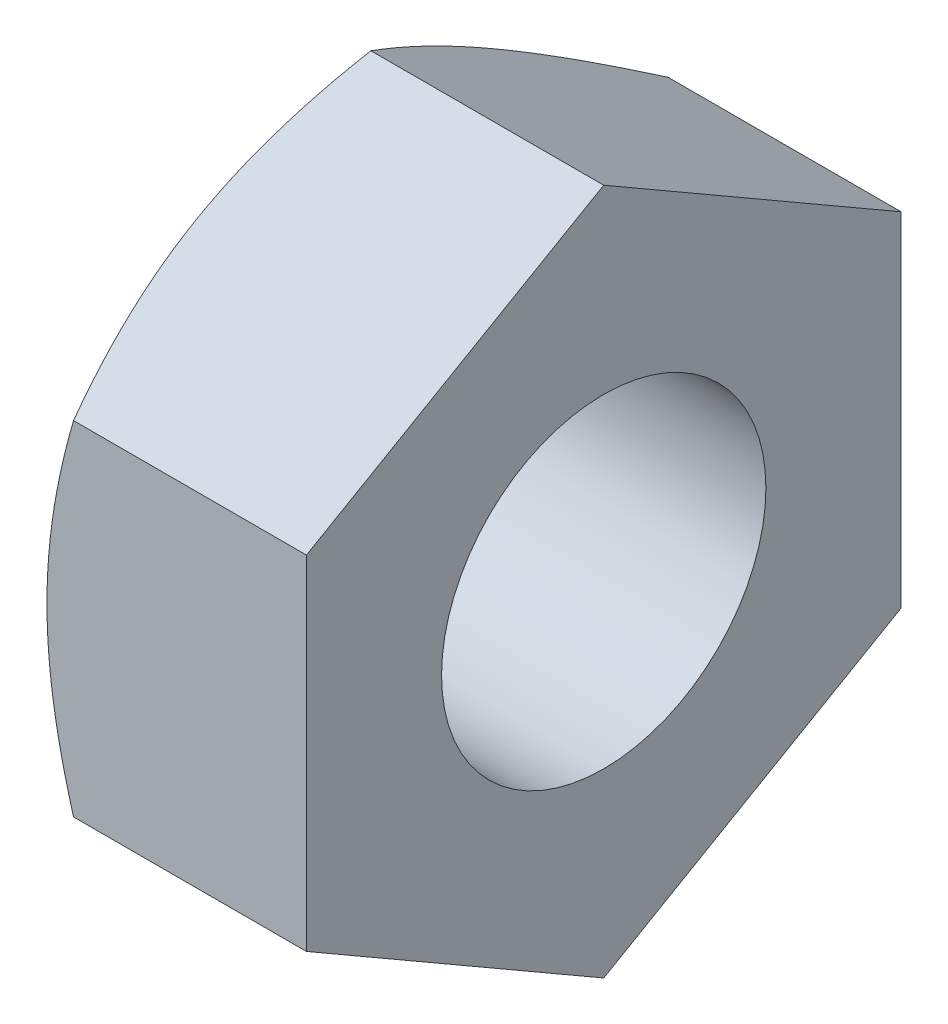
ISO-10303-21;
HEADER;
FILE_DESCRIPTION(('STEP AP214'),'2;1');
FILE_NAME('part.step','',(''),(''),'','','');
FILE_SCHEMA(('AUTOMOTIVE_DESIGN { 1 0 10303 214 1 1 1 1 }'));
ENDSEC;
DATA;
#1=APPLICATION_CONTEXT('core data for automotive mechanical design processes');
#2=APPLICATION_PROTOCOL_DEFINITION('international standard','automotive_design',2000,#1);
#3=PRODUCT_CONTEXT('',#1,'mechanical');
#4=PRODUCT('Part','Part','',(#3));
#5=PRODUCT_RELATED_PRODUCT_CATEGORY('part','',(#4));
#6=PRODUCT_DEFINITION_FORMATION('','',#4);
#7=PRODUCT_DEFINITION_CONTEXT('part definition',#1,'design');
#8=PRODUCT_DEFINITION('design','',#6,#7);
#9=PRODUCT_DEFINITION_SHAPE('','',#8);
#10=(LENGTH_UNIT() NAMED_UNIT(*) SI_UNIT(.MILLI.,.METRE.));
#11=(NAMED_UNIT(*) PLANE_ANGLE_UNIT() SI_UNIT($,.RADIAN.));
#12=(NAMED_UNIT(*) SI_UNIT($,.STERADIAN.) SOLID_ANGLE_UNIT());
#13=UNCERTAINTY_MEASURE_WITH_UNIT(LENGTH_MEASURE(1.E-05),#10,'distance_accuracy_value','');
#14=(GEOMETRIC_REPRESENTATION_CONTEXT(3) GLOBAL_UNCERTAINTY_ASSIGNED_CONTEXT((#13)) GLOBAL_UNIT_ASSIGNED_CONTEXT((#10,
#11,#12)) REPRESENTATION_CONTEXT('',''));
#15=CARTESIAN_POINT('',(0.,0.,0.));
#16=DIRECTION('',(0.,0.,1.));
#17=DIRECTION('',(1.,0.,0.));
#18=AXIS2_PLACEMENT_3D('',#15,#16,#17);
#19=CARTESIAN_POINT('',(-2.4,1.58771324027147,-2.75));
#20=DIRECTION('',(0.,0.866025403784439,-0.5));
#21=DIRECTION('',(0.,0.5,0.866025403784439));
#22=AXIS2_PLACEMENT_3D('',#19,#20,#21);
#23=PLANE('',#22);
#24=DIRECTION('',(1.,0.,0.));
#25=VECTOR('',#24,1.);
#26=CARTESIAN_POINT('',(-2.4,1.58771324027147,-2.75));
#27=LINE('',#26,#25);
#28=CARTESIAN_POINT('',(-2.15437990693814,1.58771324027146,-2.75));
#29=VERTEX_POINT('',#28);
#30=CARTESIAN_POINT('',(0.,1.58771324027147,-2.75));
#31=VERTEX_POINT('',#30);
#32=EDGE_CURVE('E139',#29,#31,#27,.T.);
#33=ORIENTED_EDGE('',*,*,#32,.F.);
#34=CARTESIAN_POINT('',(-2.15431323663524,1.58759777021763,-2.7502));
#35=CARTESIAN_POINT('',(-2.19461233775074,1.65737010029698,-2.62935077934009));
#36=CARTESIAN_POINT('',(-2.23126309740234,1.72774469983533,-2.50745839737737));
#37=CARTESIAN_POINT('',(-2.2952378170302,1.86971254687002,-2.26156287327211));
#38=CARTESIAN_POINT('',(-2.32253914432551,1.94130831721582,-2.13755536142615));
#39=CARTESIAN_POINT('',(-2.36503825470589,2.08361254889598,-1.89107720202406));
#40=CARTESIAN_POINT('',(-2.38051888137754,2.15429911309863,-1.76864448141258));
#41=CARTESIAN_POINT('',(-2.39900060263006,2.29600490065922,-1.52320285763109));
#42=CARTESIAN_POINT('',(-2.4020170005374,2.36702360884403,-1.40019484676709));
#43=CARTESIAN_POINT('',(-2.39574685457146,2.49972966594896,-1.17034121338921));
#44=CARTESIAN_POINT('',(-2.3879998457233,2.56143686540072,-1.06346120874598));
#45=CARTESIAN_POINT('',(-2.36344481893565,2.68444923614046,-0.850397532665252));
#46=CARTESIAN_POINT('',(-2.34662841034943,2.74575398185007,-0.744214598351112));
#47=CARTESIAN_POINT('',(-2.30458807765405,2.86902004703206,-0.530711510606818));
#48=CARTESIAN_POINT('',(-2.27918591931277,2.93096576264318,-0.423418383857146));
#49=CARTESIAN_POINT('',(-2.22153277416002,3.05393320806133,-0.21043252071595));
#50=CARTESIAN_POINT('',(-2.18929533670102,3.11495651365995,-0.104737054973348));
#51=CARTESIAN_POINT('',(-2.15431323663525,3.17554195059677,0.000199999999999626));
#52=B_SPLINE_CURVE_WITH_KNOTS('',3,(#34,#35,#36,#37,#38,#39,#40,#41,#42,#43,#44,#45,#46,#47,#48,
#49,#50,#51),.UNSPECIFIED.,.F.,.F.,(4,2,2,2,2,2,2,2,4),(0.,0.435912828725887,0.87287355711633,
1.29901931904671,1.72464171213573,2.09526089052937,2.46622354066374,2.84541551798557,
3.22386274754524),.UNSPECIFIED.);
#53=CARTESIAN_POINT('',(-2.4,2.38156986040721,-1.375));
#54=VERTEX_POINT('',#53);
#55=EDGE_CURVE('E120',#29,#54,#52,.T.);
#56=ORIENTED_EDGE('',*,*,#55,.T.);
#57=CARTESIAN_POINT('',(-2.15437990693814,3.17542648054294,0.));
#58=VERTEX_POINT('',#57);
#59=EDGE_CURVE('E52',#54,#58,#52,.T.);
#60=ORIENTED_EDGE('',*,*,#59,.T.);
#61=DIRECTION('',(1.,0.,0.));
#62=VECTOR('',#61,1.);
#63=CARTESIAN_POINT('',(-2.4,3.17542648054294,0.));
#64=LINE('',#63,#62);
#65=CARTESIAN_POINT('',(0.,3.17542648054294,0.));
#66=VERTEX_POINT('',#65);
#67=EDGE_CURVE('E118',#58,#66,#64,.T.);
#68=ORIENTED_EDGE('',*,*,#67,.T.);
#69=DIRECTION('',(0.,0.5,0.866025403784439));
#70=VECTOR('',#69,1.);
#71=CARTESIAN_POINT('',(0.,1.58771324027147,-2.75));
#72=LINE('',#71,#70);
#73=EDGE_CURVE('E150',#31,#66,#72,.T.);
#74=ORIENTED_EDGE('',*,*,#73,.F.);
#75=EDGE_LOOP('',(#33,#56,#60,#68,#74));
#76=FACE_BOUND('',#75,.T.);
#77=ADVANCED_FACE('F36',(#76),#23,.T.);
#78=CARTESIAN_POINT('',(-2.4,-1.58771324027148,-2.75));
#79=DIRECTION('',(0.,0.,-1.));
#80=DIRECTION('',(-1.,0.,0.));
#81=AXIS2_PLACEMENT_3D('',#78,#79,#80);
#82=PLANE('',#81);
#83=DIRECTION('',(1.,0.,0.));
#84=VECTOR('',#83,1.);
#85=CARTESIAN_POINT('',(-2.4,-1.58771324027148,-2.75));
#86=LINE('',#85,#84);
#87=CARTESIAN_POINT('',(-2.15437990693814,-1.58771324027149,-2.74999999999998));
#88=VERTEX_POINT('',#87);
#89=CARTESIAN_POINT('',(0.,-1.58771324027148,-2.75));
#90=VERTEX_POINT('',#89);
#91=EDGE_CURVE('E137',#88,#90,#86,.T.);
#92=ORIENTED_EDGE('',*,*,#91,.F.);
#93=CARTESIAN_POINT('',(-1.08405156039708,-4.21084949309676,-2.75));
#94=CARTESIAN_POINT('',(-1.14240006384777,-4.0901089421409,-2.75));
#95=CARTESIAN_POINT('',(-1.20016853488243,-3.9690829206551,-2.75));
#96=CARTESIAN_POINT('',(-1.31421396157696,-3.72630558284844,-2.75));
#97=CARTESIAN_POINT('',(-1.37049065899754,-3.60455414536201,-2.75));
#98=CARTESIAN_POINT('',(-1.48151755664725,-3.35951393034355,-2.75));
#99=CARTESIAN_POINT('',(-1.53625717839417,-3.23622034236437,-2.75));
#100=CARTESIAN_POINT('',(-1.64338522252356,-2.98861980138744,-2.75));
#101=CARTESIAN_POINT('',(-1.69577376746325,-2.86431290161182,-2.75));
#102=CARTESIAN_POINT('',(-1.79819642785388,-2.61294485887172,-2.75));
#103=CARTESIAN_POINT('',(-1.84819374210161,-2.48586863815655,-2.75));
#104=CARTESIAN_POINT('',(-1.9442725912154,-2.23021732171541,-2.75));
#105=CARTESIAN_POINT('',(-1.99035369042303,-2.10164206103364,-2.75));
#106=CARTESIAN_POINT('',(-2.07736192295377,-1.84305218799468,-2.75));
#107=CARTESIAN_POINT('',(-2.11830001358611,-1.71304130052584,-2.75));
#108=CARTESIAN_POINT('',(-2.19369269237565,-1.45117125062148,-2.75));
#109=CARTESIAN_POINT('',(-2.22814933084723,-1.31931268690203,-2.75));
#110=CARTESIAN_POINT('',(-2.2889063284691,-1.05365722480013,-2.75));
#111=CARTESIAN_POINT('',(-2.31520451590488,-0.919859820217597,-2.75));
#112=CARTESIAN_POINT('',(-2.35787396280339,-0.650651874037387,-2.75));
#113=CARTESIAN_POINT('',(-2.37424521348946,-0.515241331013601,-2.75));
#114=CARTESIAN_POINT('',(-2.39561250345976,-0.244373242869217,-2.75));
#115=CARTESIAN_POINT('',(-2.40068055677322,-0.108921526377139,-2.75));
#116=CARTESIAN_POINT('',(-2.39917220436733,0.161887058855127,-2.75));
#117=CARTESIAN_POINT('',(-2.39259882131445,0.297243943089634,-2.75));
#118=CARTESIAN_POINT('',(-2.37189586995316,0.528385436717537,-2.75));
#119=CARTESIAN_POINT('',(-2.36046235896981,0.624425050137497,-2.75));
#120=CARTESIAN_POINT('',(-2.33247828038665,0.815762399811543,-2.75));
#121=CARTESIAN_POINT('',(-2.31592690577232,0.911060016631967,-2.75));
#122=CARTESIAN_POINT('',(-2.25946463872172,1.19576218748917,-2.75));
#123=CARTESIAN_POINT('',(-2.21276014058271,1.38383224738498,-2.75));
#124=CARTESIAN_POINT('',(-2.13220750296942,1.66525048947487,-2.75));
#125=CARTESIAN_POINT('',(-2.1031966650045,1.76006556248559,-2.75));
#126=CARTESIAN_POINT('',(-2.04230435109341,1.94870609382217,-2.75));
#127=CARTESIAN_POINT('',(-2.0104248551215,2.04253218553698,-2.75));
#128=CARTESIAN_POINT('',(-1.94445858181355,2.22880240354987,-2.75));
#129=CARTESIAN_POINT('',(-1.91038523854447,2.32125133588454,-2.75));
#130=CARTESIAN_POINT('',(-1.84023863176889,2.50543192042631,-2.75));
#131=CARTESIAN_POINT('',(-1.80416455996268,2.59716326539582,-2.75));
#132=CARTESIAN_POINT('',(-1.76728755800251,2.68856293053349,-2.75));
#133=B_SPLINE_CURVE_WITH_KNOTS('',3,(#93,#94,#95,#96,#97,#98,#99,#100,#101,#102,#103,#104,#105,
#106,#107,#108,#109,#110,#111,#112,#113,#114,#115,#116,#117,#118,#119,#120,#121,#122,#123,#124,
#125,#126,#127,#128,#129,#130,#131,#132),.UNSPECIFIED.,.F.,.F.,(4,2,2,2,2,2,2,2,2,2,2,2,2,2,2,2,
2,2,2,4),(0.,0.402305607365936,0.804680408536997,1.20935783819118,1.61401414820818,
2.0236383818577,2.43330812457348,2.842089694796,3.25074173456636,3.65950246109143,
4.06826354901183,4.47441284024649,4.88045669141171,5.17046846817546,5.46052599902452,
6.04107275309884,6.33851131304663,6.63574613017457,6.93130791005795,7.22698998004825),.UNSPECIFIED.);
#134=CARTESIAN_POINT('',(-2.4,0.,-2.75));
#135=VERTEX_POINT('',#134);
#136=EDGE_CURVE('E241',#88,#135,#133,.T.);
#137=ORIENTED_EDGE('',*,*,#136,.T.);
#138=EDGE_CURVE('E163',#135,#29,#133,.T.);
#139=ORIENTED_EDGE('',*,*,#138,.T.);
#140=ORIENTED_EDGE('',*,*,#32,.T.);
#141=DIRECTION('',(0.,1.,0.));
#142=VECTOR('',#141,1.);
#143=CARTESIAN_POINT('',(0.,-1.58771324027148,-2.75));
#144=LINE('',#143,#142);
#145=EDGE_CURVE('E127',#90,#31,#144,.T.);
#146=ORIENTED_EDGE('',*,*,#145,.F.);
#147=EDGE_LOOP('',(#92,#137,#139,#140,#146));
#148=FACE_BOUND('',#147,.T.);
#149=ADVANCED_FACE('F227',(#148),#82,.T.);
#150=CARTESIAN_POINT('',(-2.4,-3.17542648054295,0.));
#151=DIRECTION('',(0.,-0.866025403784439,-0.5));
#152=DIRECTION('',(0.,0.5,-0.866025403784439));
#153=AXIS2_PLACEMENT_3D('',#150,#151,#152);
#154=PLANE('',#153);
#155=DIRECTION('',(1.,0.,0.));
#156=VECTOR('',#155,1.);
#157=CARTESIAN_POINT('',(-2.4,-3.17542648054295,0.));
#158=LINE('',#157,#156);
#159=CARTESIAN_POINT('',(-2.15437990693814,-3.17542648054294,0.));
#160=VERTEX_POINT('',#159);
#161=CARTESIAN_POINT('',(0.,-3.17542648054295,0.));
#162=VERTEX_POINT('',#161);
#163=EDGE_CURVE('E135',#160,#162,#158,.T.);
#164=ORIENTED_EDGE('',*,*,#163,.F.);
#165=CARTESIAN_POINT('',(-2.15431323663524,-3.17554195059679,0.000199999999999914));
#166=CARTESIAN_POINT('',(-2.19461233775074,-3.10576962051743,-0.120649220659906));
#167=CARTESIAN_POINT('',(-2.23126309740234,-3.03539502097909,-0.242541602622635));
#168=CARTESIAN_POINT('',(-2.2952378170302,-2.89342717394439,-0.488437126727894));
#169=CARTESIAN_POINT('',(-2.3225391443255,-2.82183140359859,-0.612444638573857));
#170=CARTESIAN_POINT('',(-2.36503825470588,-2.67952717191843,-0.858922797975945));
#171=CARTESIAN_POINT('',(-2.38051888137754,-2.60884060771578,-0.981355518587419));
#172=CARTESIAN_POINT('',(-2.39900060263006,-2.46713482015519,-1.22679714236892));
#173=CARTESIAN_POINT('',(-2.4020170005374,-2.39611611197038,-1.34980515323291));
#174=CARTESIAN_POINT('',(-2.39574685457145,-2.26341005486545,-1.5796587866108));
#175=CARTESIAN_POINT('',(-2.38799984572329,-2.20170285541369,-1.68653879125402));
#176=CARTESIAN_POINT('',(-2.36344481893564,-2.07869048467395,-1.89960246733475));
#177=CARTESIAN_POINT('',(-2.34662841034943,-2.01738573896434,-2.00578540164889));
#178=CARTESIAN_POINT('',(-2.30458807765404,-1.89411967378236,-2.21928848939318));
#179=CARTESIAN_POINT('',(-2.27918591931277,-1.83217395817124,-2.32658161614286));
#180=CARTESIAN_POINT('',(-2.22153277416002,-1.70920651275308,-2.53956747928405));
#181=CARTESIAN_POINT('',(-2.18929533670102,-1.64818320715447,-2.64526294502665));
#182=CARTESIAN_POINT('',(-2.15431323663524,-1.58759777021764,-2.7502));
#183=B_SPLINE_CURVE_WITH_KNOTS('',3,(#165,#166,#167,#168,#169,#170,#171,#172,#173,#174,#175,
#176,#177,#178,#179,#180,#181,#182),.UNSPECIFIED.,.F.,.F.,(4,2,2,2,2,2,2,2,4),(0.,
0.435912828725889,0.872873557116333,1.29901931904672,1.72464171213574,2.09526089052938,
2.46622354066374,2.84541551798557,3.22386274754524),.UNSPECIFIED.);
#184=CARTESIAN_POINT('',(-2.4,-2.38156986040721,-1.375));
#185=VERTEX_POINT('',#184);
#186=EDGE_CURVE('E152',#160,#185,#183,.T.);
#187=ORIENTED_EDGE('',*,*,#186,.T.);
#188=EDGE_CURVE('E153',#185,#88,#183,.T.);
#189=ORIENTED_EDGE('',*,*,#188,.T.);
#190=ORIENTED_EDGE('',*,*,#91,.T.);
#191=DIRECTION('',(0.,0.5,-0.866025403784439));
#192=VECTOR('',#191,1.);
#193=CARTESIAN_POINT('',(0.,-3.17542648054295,0.));
#194=LINE('',#193,#192);
#195=EDGE_CURVE('E131',#162,#90,#194,.T.);
#196=ORIENTED_EDGE('',*,*,#195,.F.);
#197=EDGE_LOOP('',(#164,#187,#189,#190,#196));
#198=FACE_BOUND('',#197,.T.);
#199=ADVANCED_FACE('F170',(#198),#154,.T.);
#200=CARTESIAN_POINT('',(-2.4,-1.58771324027148,2.75));
#201=DIRECTION('',(0.,-0.866025403784439,0.5));
#202=DIRECTION('',(0.,-0.5,-0.866025403784439));
#203=AXIS2_PLACEMENT_3D('',#200,#201,#202);
#204=PLANE('',#203);
#205=DIRECTION('',(1.,0.,0.));
#206=VECTOR('',#205,1.);
#207=CARTESIAN_POINT('',(-2.4,-1.58771324027148,2.75));
#208=LINE('',#207,#206);
#209=CARTESIAN_POINT('',(-2.15437990693814,-1.58771324027146,2.75));
#210=VERTEX_POINT('',#209);
#211=CARTESIAN_POINT('',(0.,-1.58771324027148,2.75));
#212=VERTEX_POINT('',#211);
#213=EDGE_CURVE('E128',#210,#212,#208,.T.);
#214=ORIENTED_EDGE('',*,*,#213,.F.);
#215=CARTESIAN_POINT('',(-2.15431323663524,-1.58759777021764,2.7502));
#216=CARTESIAN_POINT('',(-2.19461233775074,-1.65737010029699,2.62935077934009));
#217=CARTESIAN_POINT('',(-2.23126309740234,-1.72774469983534,2.50745839737737));
#218=CARTESIAN_POINT('',(-2.2952378170302,-1.86971254687003,2.26156287327211));
#219=CARTESIAN_POINT('',(-2.3225391443255,-1.94130831721584,2.13755536142614));
#220=CARTESIAN_POINT('',(-2.36503825470588,-2.083612548896,1.89107720202406));
#221=CARTESIAN_POINT('',(-2.38051888137754,-2.15429911309865,1.76864448141258));
#222=CARTESIAN_POINT('',(-2.39900060263006,-2.29600490065924,1.52320285763108));
#223=CARTESIAN_POINT('',(-2.4020170005374,-2.36702360884404,1.40019484676709));
#224=CARTESIAN_POINT('',(-2.39574685457145,-2.49972966594898,1.17034121338921));
#225=CARTESIAN_POINT('',(-2.38799984572329,-2.56143686540073,1.06346120874598));
#226=CARTESIAN_POINT('',(-2.36344481893564,-2.68444923614047,0.85039753266525));
#227=CARTESIAN_POINT('',(-2.34662841034943,-2.74575398185009,0.744214598351111));
#228=CARTESIAN_POINT('',(-2.30458807765404,-2.86902004703207,0.530711510606816));
#229=CARTESIAN_POINT('',(-2.27918591931277,-2.93096576264319,0.423418383857145));
#230=CARTESIAN_POINT('',(-2.22153277416002,-3.05393320806134,0.210432520715949));
#231=CARTESIAN_POINT('',(-2.18929533670102,-3.11495651365996,0.104737054973347));
#232=CARTESIAN_POINT('',(-2.15431323663524,-3.17554195059679,-0.000199999999999977));
#233=B_SPLINE_CURVE_WITH_KNOTS('',3,(#215,#216,#217,#218,#219,#220,#221,#222,#223,#224,#225,
#226,#227,#228,#229,#230,#231,#232),.UNSPECIFIED.,.F.,.F.,(4,2,2,2,2,2,2,2,4),(0.,
0.435912828725889,0.872873557116332,1.29901931904672,1.72464171213574,2.09526089052937,
2.46622354066374,2.84541551798557,3.22386274754524),.UNSPECIFIED.);
#234=CARTESIAN_POINT('',(-2.4,-2.38156986040721,1.375));
#235=VERTEX_POINT('',#234);
#236=EDGE_CURVE('E203',#210,#235,#233,.T.);
#237=ORIENTED_EDGE('',*,*,#236,.T.);
#238=EDGE_CURVE('E162',#235,#160,#233,.T.);
#239=ORIENTED_EDGE('',*,*,#238,.T.);
#240=ORIENTED_EDGE('',*,*,#163,.T.);
#241=DIRECTION('',(0.,-0.5,-0.866025403784438));
#242=VECTOR('',#241,1.);
#243=CARTESIAN_POINT('',(0.,-1.58771324027148,2.75));
#244=LINE('',#243,#242);
#245=EDGE_CURVE('E143',#212,#162,#244,.T.);
#246=ORIENTED_EDGE('',*,*,#245,.F.);
#247=EDGE_LOOP('',(#214,#237,#239,#240,#246));
#248=FACE_BOUND('',#247,.T.);
#249=ADVANCED_FACE('F210',(#248),#204,.T.);
#250=CARTESIAN_POINT('',(-2.4,1.58771324027147,2.75));
#251=DIRECTION('',(0.,0.,1.));
#252=DIRECTION('',(1.,0.,0.));
#253=AXIS2_PLACEMENT_3D('',#250,#251,#252);
#254=PLANE('',#253);
#255=DIRECTION('',(1.,0.,0.));
#256=VECTOR('',#255,1.);
#257=CARTESIAN_POINT('',(-2.4,1.58771324027147,2.75));
#258=LINE('',#257,#256);
#259=CARTESIAN_POINT('',(-2.15437990693814,1.58771324027147,2.75));
#260=VERTEX_POINT('',#259);
#261=CARTESIAN_POINT('',(0.,1.58771324027147,2.75));
#262=VERTEX_POINT('',#261);
#263=EDGE_CURVE('E126',#260,#262,#258,.T.);
#264=ORIENTED_EDGE('',*,*,#263,.F.);
#265=CARTESIAN_POINT('',(-1.08405156039708,-4.21084949309676,2.75));
#266=CARTESIAN_POINT('',(-1.14240006384777,-4.0901089421409,2.75));
#267=CARTESIAN_POINT('',(-1.20016853488243,-3.9690829206551,2.75));
#268=CARTESIAN_POINT('',(-1.31421396157696,-3.72630558284844,2.75));
#269=CARTESIAN_POINT('',(-1.37049065899754,-3.60455414536201,2.75));
#270=CARTESIAN_POINT('',(-1.48151755664725,-3.35951393034355,2.75));
#271=CARTESIAN_POINT('',(-1.53625717839417,-3.23622034236437,2.75));
#272=CARTESIAN_POINT('',(-1.64338522252356,-2.98861980138744,2.75));
#273=CARTESIAN_POINT('',(-1.69577376746325,-2.86431290161182,2.75));
#274=CARTESIAN_POINT('',(-1.79819642785388,-2.61294485887172,2.75));
#275=CARTESIAN_POINT('',(-1.84819374210161,-2.48586863815655,2.75));
#276=CARTESIAN_POINT('',(-1.9442725912154,-2.23021732171541,2.75));
#277=CARTESIAN_POINT('',(-1.99035369042303,-2.10164206103364,2.75));
#278=CARTESIAN_POINT('',(-2.07736192295377,-1.84305218799468,2.75));
#279=CARTESIAN_POINT('',(-2.11830001358611,-1.71304130052584,2.75));
#280=CARTESIAN_POINT('',(-2.19369269237565,-1.45117125062148,2.75));
#281=CARTESIAN_POINT('',(-2.22814933084723,-1.31931268690203,2.75));
#282=CARTESIAN_POINT('',(-2.2889063284691,-1.05365722480013,2.75));
#283=CARTESIAN_POINT('',(-2.31520451590488,-0.919859820217596,2.75));
#284=CARTESIAN_POINT('',(-2.35787396280339,-0.650651874037386,2.75));
#285=CARTESIAN_POINT('',(-2.37424521348946,-0.5152413310136,2.75));
#286=CARTESIAN_POINT('',(-2.39561250345976,-0.244373242869216,2.75));
#287=CARTESIAN_POINT('',(-2.40068055677322,-0.108921526377138,2.75));
#288=CARTESIAN_POINT('',(-2.39917220436733,0.161887058855129,2.75));
#289=CARTESIAN_POINT('',(-2.39259882131445,0.297243943089635,2.75));
#290=CARTESIAN_POINT('',(-2.37189586995316,0.528385436717538,2.75));
#291=CARTESIAN_POINT('',(-2.36046235896981,0.624425050137498,2.75));
#292=CARTESIAN_POINT('',(-2.33247828038665,0.815762399811544,2.75));
#293=CARTESIAN_POINT('',(-2.31592690577232,0.911060016631968,2.75));
#294=CARTESIAN_POINT('',(-2.25946463872172,1.19576218748917,2.75));
#295=CARTESIAN_POINT('',(-2.21276014058271,1.38383224738498,2.75));
#296=CARTESIAN_POINT('',(-2.13220750296942,1.66525048947487,2.75));
#297=CARTESIAN_POINT('',(-2.1031966650045,1.7600655624856,2.75));
#298=CARTESIAN_POINT('',(-2.04230435109341,1.94870609382217,2.75));
#299=CARTESIAN_POINT('',(-2.01042485512149,2.04253218553698,2.75));
#300=CARTESIAN_POINT('',(-1.94445858181355,2.22880240354987,2.75));
#301=CARTESIAN_POINT('',(-1.91038523854446,2.32125133588454,2.75));
#302=CARTESIAN_POINT('',(-1.84023863176889,2.50543192042631,2.75));
#303=CARTESIAN_POINT('',(-1.80416455996268,2.59716326539582,2.75));
#304=CARTESIAN_POINT('',(-1.76728755800251,2.68856293053349,2.75));
#305=B_SPLINE_CURVE_WITH_KNOTS('',3,(#265,#266,#267,#268,#269,#270,#271,#272,#273,#274,#275,
#276,#277,#278,#279,#280,#281,#282,#283,#284,#285,#286,#287,#288,#289,#290,#291,#292,#293,#294,
#295,#296,#297,#298,#299,#300,#301,#302,#303,#304),.UNSPECIFIED.,.F.,.F.,(4,2,2,2,2,2,2,2,2,2,2,
2,2,2,2,2,2,2,2,4),(0.,0.402305607365936,0.804680408536996,1.20935783819118,1.61401414820818,
2.0236383818577,2.43330812457348,2.842089694796,3.25074173456636,3.65950246109143,
4.06826354901183,4.47441284024649,4.88045669141171,5.17046846817546,5.46052599902452,
6.04107275309884,6.33851131304663,6.63574613017457,6.93130791005795,7.22698998004826),.UNSPECIFIED.);
#306=CARTESIAN_POINT('',(-2.4,0.,2.75));
#307=VERTEX_POINT('',#306);
#308=EDGE_CURVE('E112',#260,#307,#305,.F.);
#309=ORIENTED_EDGE('',*,*,#308,.T.);
#310=EDGE_CURVE('E209',#307,#210,#305,.F.);
#311=ORIENTED_EDGE('',*,*,#310,.T.);
#312=ORIENTED_EDGE('',*,*,#213,.T.);
#313=DIRECTION('',(0.,-1.,0.));
#314=VECTOR('',#313,1.);
#315=CARTESIAN_POINT('',(0.,1.58771324027147,2.75));
#316=LINE('',#315,#314);
#317=EDGE_CURVE('E146',#262,#212,#316,.T.);
#318=ORIENTED_EDGE('',*,*,#317,.F.);
#319=EDGE_LOOP('',(#264,#309,#311,#312,#318));
#320=FACE_BOUND('',#319,.T.);
#321=ADVANCED_FACE('F213',(#320),#254,.T.);
#322=CARTESIAN_POINT('',(-2.4,3.17542648054294,0.));
#323=DIRECTION('',(0.,0.866025403784439,0.5));
#324=DIRECTION('',(0.,-0.5,0.866025403784439));
#325=AXIS2_PLACEMENT_3D('',#322,#323,#324);
#326=PLANE('',#325);
#327=ORIENTED_EDGE('',*,*,#67,.F.);
#328=CARTESIAN_POINT('',(-2.15431323663525,3.17554195059677,-0.000200000000000679));
#329=CARTESIAN_POINT('',(-2.19461233775074,3.10576962051742,0.120649220659905));
#330=CARTESIAN_POINT('',(-2.23126309740234,3.03539502097907,0.242541602622633));
#331=CARTESIAN_POINT('',(-2.2952378170302,2.89342717394438,0.488437126727891));
#332=CARTESIAN_POINT('',(-2.32253914432551,2.82183140359858,0.612444638573853));
#333=CARTESIAN_POINT('',(-2.36503825470589,2.67952717191842,0.858922797975941));
#334=CARTESIAN_POINT('',(-2.38051888137755,2.60884060771577,0.981355518587414));
#335=CARTESIAN_POINT('',(-2.39900060263006,2.46713482015518,1.22679714236891));
#336=CARTESIAN_POINT('',(-2.4020170005374,2.39611611197037,1.34980515323291));
#337=CARTESIAN_POINT('',(-2.39574685457146,2.26341005486544,1.57965878661079));
#338=CARTESIAN_POINT('',(-2.3879998457233,2.20170285541368,1.68653879125402));
#339=CARTESIAN_POINT('',(-2.36344481893565,2.07869048467394,1.89960246733475));
#340=CARTESIAN_POINT('',(-2.34662841034943,2.01738573896433,2.00578540164889));
#341=CARTESIAN_POINT('',(-2.30458807765405,1.89411967378234,2.21928848939318));
#342=CARTESIAN_POINT('',(-2.27918591931277,1.83217395817122,2.32658161614285));
#343=CARTESIAN_POINT('',(-2.22153277416002,1.70920651275307,2.53956747928405));
#344=CARTESIAN_POINT('',(-2.18929533670102,1.64818320715446,2.64526294502665));
#345=CARTESIAN_POINT('',(-2.15431323663524,1.58759777021763,2.7502));
#346=B_SPLINE_CURVE_WITH_KNOTS('',3,(#328,#329,#330,#331,#332,#333,#334,#335,#336,#337,#338,
#339,#340,#341,#342,#343,#344,#345),.UNSPECIFIED.,.F.,.F.,(4,2,2,2,2,2,2,2,4),(0.,
0.435912828725887,0.872873557116329,1.29901931904671,1.72464171213573,2.09526089052937,
2.46622354066374,2.84541551798557,3.22386274754524),.UNSPECIFIED.);
#347=CARTESIAN_POINT('',(-2.4,2.38156986040721,1.375));
#348=VERTEX_POINT('',#347);
#349=EDGE_CURVE('E106',#58,#348,#346,.T.);
#350=ORIENTED_EDGE('',*,*,#349,.T.);
#351=EDGE_CURVE('E59',#348,#260,#346,.T.);
#352=ORIENTED_EDGE('',*,*,#351,.T.);
#353=ORIENTED_EDGE('',*,*,#263,.T.);
#354=DIRECTION('',(0.,-0.5,0.866025403784439));
#355=VECTOR('',#354,1.);
#356=CARTESIAN_POINT('',(0.,3.17542648054294,0.));
#357=LINE('',#356,#355);
#358=EDGE_CURVE('E124',#66,#262,#357,.T.);
#359=ORIENTED_EDGE('',*,*,#358,.F.);
#360=EDGE_LOOP('',(#327,#350,#352,#353,#359));
#361=FACE_BOUND('',#360,.T.);
#362=ADVANCED_FACE('F122',(#361),#326,.T.);
#363=CARTESIAN_POINT('',(0.,0.,0.));
#364=DIRECTION('',(1.,0.,0.));
#365=DIRECTION('',(0.,0.,-1.));
#366=AXIS2_PLACEMENT_3D('',#363,#364,#365);
#367=PLANE('',#366);
#368=CARTESIAN_POINT('',(0.,0.,0.));
#369=DIRECTION('',(1.,0.,0.));
#370=DIRECTION('',(0.,0.,-1.));
#371=AXIS2_PLACEMENT_3D('',#368,#369,#370);
#372=CIRCLE('',#371,1.5);
#373=CARTESIAN_POINT('',(0.,0.,-1.5));
#374=VERTEX_POINT('',#373);
#375=EDGE_CURVE('E270',#374,#374,#372,.T.);
#376=ORIENTED_EDGE('',*,*,#375,.F.);
#377=EDGE_LOOP('',(#376));
#378=FACE_BOUND('',#377,.T.);
#379=ORIENTED_EDGE('',*,*,#73,.T.);
#380=ORIENTED_EDGE('',*,*,#358,.T.);
#381=ORIENTED_EDGE('',*,*,#317,.T.);
#382=ORIENTED_EDGE('',*,*,#245,.T.);
#383=ORIENTED_EDGE('',*,*,#195,.T.);
#384=ORIENTED_EDGE('',*,*,#145,.T.);
#385=EDGE_LOOP('',(#379,#380,#381,#382,#383,#384));
#386=FACE_BOUND('',#385,.T.);
#387=ADVANCED_FACE('F220',(#378,#386),#367,.T.);
#388=CARTESIAN_POINT('',(-2.4,0.,0.));
#389=DIRECTION('',(1.,0.,0.));
#390=DIRECTION('',(0.,0.,-1.));
#391=AXIS2_PLACEMENT_3D('',#388,#389,#390);
#392=CONICAL_SURFACE('',#391,2.75,1.0471975511966);
#393=CARTESIAN_POINT('',(-2.4,0.,0.));
#394=DIRECTION('',(1.,0.,0.));
#395=DIRECTION('',(0.,0.,-1.));
#396=AXIS2_PLACEMENT_3D('',#393,#394,#395);
#397=CIRCLE('',#396,2.75);
#398=EDGE_CURVE('E40',#185,#135,#397,.T.);
#399=ORIENTED_EDGE('',*,*,#398,.T.);
#400=ORIENTED_EDGE('',*,*,#136,.F.);
#401=ORIENTED_EDGE('',*,*,#188,.F.);
#402=EDGE_LOOP('',(#399,#400,#401));
#403=FACE_BOUND('',#402,.T.);
#404=ADVANCED_FACE('F224',(#403),#392,.T.);
#405=ORIENTED_EDGE('',*,*,#238,.F.);
#406=EDGE_CURVE('E254',#235,#185,#397,.T.);
#407=ORIENTED_EDGE('',*,*,#406,.T.);
#408=ORIENTED_EDGE('',*,*,#186,.F.);
#409=EDGE_LOOP('',(#405,#407,#408));
#410=FACE_BOUND('',#409,.T.);
#411=ADVANCED_FACE('F179',(#410),#392,.T.);
#412=ORIENTED_EDGE('',*,*,#310,.F.);
#413=EDGE_CURVE('E258',#307,#235,#397,.T.);
#414=ORIENTED_EDGE('',*,*,#413,.T.);
#415=ORIENTED_EDGE('',*,*,#236,.F.);
#416=EDGE_LOOP('',(#412,#414,#415));
#417=FACE_BOUND('',#416,.T.);
#418=ADVANCED_FACE('F178',(#417),#392,.T.);
#419=ORIENTED_EDGE('',*,*,#351,.F.);
#420=CARTESIAN_POINT('',(-2.4,0.,0.));
#421=DIRECTION('',(-1.,0.,0.));
#422=DIRECTION('',(0.,0.,1.));
#423=AXIS2_PLACEMENT_3D('',#420,#421,#422);
#424=CIRCLE('',#423,2.75);
#425=EDGE_CURVE('E267',#307,#348,#424,.T.);
#426=ORIENTED_EDGE('',*,*,#425,.F.);
#427=ORIENTED_EDGE('',*,*,#308,.F.);
#428=EDGE_LOOP('',(#419,#426,#427));
#429=FACE_BOUND('',#428,.T.);
#430=ADVANCED_FACE('F173',(#429),#392,.T.);
#431=EDGE_CURVE('E45',#54,#348,#397,.T.);
#432=ORIENTED_EDGE('',*,*,#431,.T.);
#433=ORIENTED_EDGE('',*,*,#349,.F.);
#434=ORIENTED_EDGE('',*,*,#59,.F.);
#435=EDGE_LOOP('',(#432,#433,#434));
#436=FACE_BOUND('',#435,.T.);
#437=ADVANCED_FACE('F107',(#436),#392,.T.);
#438=EDGE_CURVE('E11',#135,#54,#397,.T.);
#439=ORIENTED_EDGE('',*,*,#438,.T.);
#440=ORIENTED_EDGE('',*,*,#55,.F.);
#441=ORIENTED_EDGE('',*,*,#138,.F.);
#442=EDGE_LOOP('',(#439,#440,#441));
#443=FACE_BOUND('',#442,.T.);
#444=ADVANCED_FACE('F263',(#443),#392,.T.);
#445=CARTESIAN_POINT('',(-2.4,0.,0.));
#446=DIRECTION('',(1.,0.,0.));
#447=DIRECTION('',(0.,0.,-1.));
#448=AXIS2_PLACEMENT_3D('',#445,#446,#447);
#449=PLANE('',#448);
#450=CARTESIAN_POINT('',(-2.4,0.,0.));
#451=DIRECTION('',(1.,0.,0.));
#452=DIRECTION('',(0.,0.,-1.));
#453=AXIS2_PLACEMENT_3D('',#450,#451,#452);
#454=CIRCLE('',#453,1.5);
#455=CARTESIAN_POINT('',(-2.4,0.,-1.5));
#456=VERTEX_POINT('',#455);
#457=EDGE_CURVE('E268',#456,#456,#454,.T.);
#458=ORIENTED_EDGE('',*,*,#457,.T.);
#459=EDGE_LOOP('',(#458));
#460=FACE_BOUND('',#459,.T.);
#461=ORIENTED_EDGE('',*,*,#438,.F.);
#462=ORIENTED_EDGE('',*,*,#398,.F.);
#463=ORIENTED_EDGE('',*,*,#406,.F.);
#464=ORIENTED_EDGE('',*,*,#413,.F.);
#465=ORIENTED_EDGE('',*,*,#425,.T.);
#466=ORIENTED_EDGE('',*,*,#431,.F.);
#467=EDGE_LOOP('',(#461,#462,#463,#464,#465,#466));
#468=FACE_BOUND('',#467,.T.);
#469=ADVANCED_FACE('F181',(#460,#468),#449,.F.);
#470=CARTESIAN_POINT('',(-2.4,0.,0.));
#471=DIRECTION('',(1.,0.,0.));
#472=DIRECTION('',(0.,0.,-1.));
#473=AXIS2_PLACEMENT_3D('',#470,#471,#472);
#474=CYLINDRICAL_SURFACE('',#473,1.5);
#475=ORIENTED_EDGE('',*,*,#457,.F.);
#476=EDGE_LOOP('',(#475));
#477=FACE_BOUND('',#476,.T.);
#478=ORIENTED_EDGE('',*,*,#375,.T.);
#479=EDGE_LOOP('',(#478));
#480=FACE_BOUND('',#479,.T.);
#481=ADVANCED_FACE('F180',(#477,#480),#474,.F.);
#482=CLOSED_SHELL('',(#77,#149,#199,#249,#321,#362,#387,#404,#411,#418,#430,#437,#444,#469,#481));
#483=MANIFOLD_SOLID_BREP('B2',#482);
#484=ADVANCED_BREP_SHAPE_REPRESENTATION('',(#18,#483),#14);
#485=SHAPE_DEFINITION_REPRESENTATION(#9,#484);
ENDSEC;
END-ISO-10303-21;
